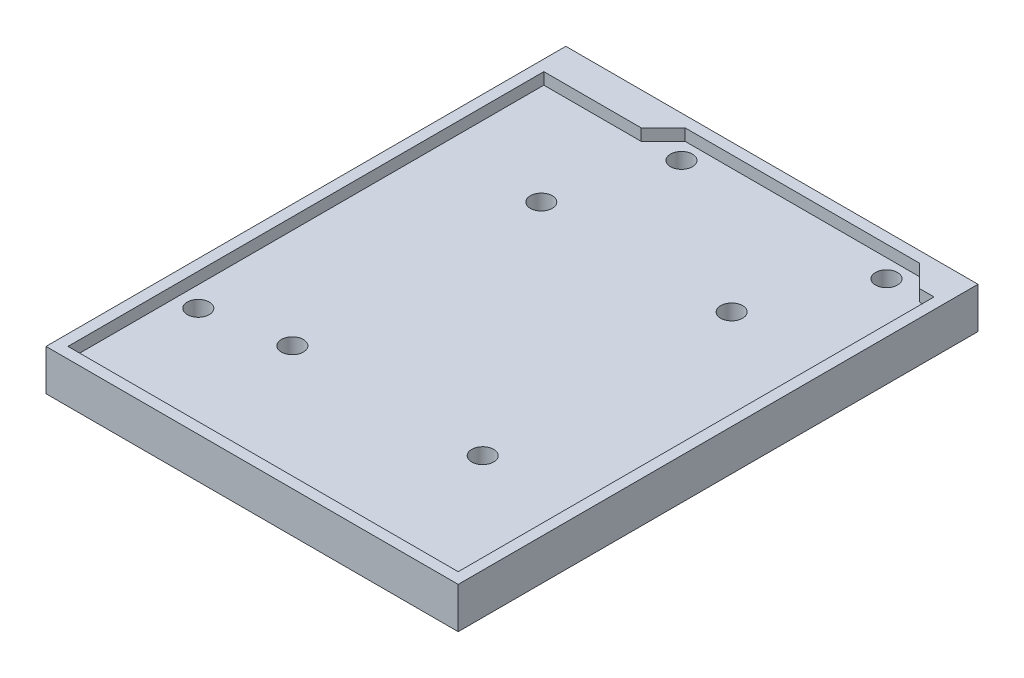
ISO-10303-21;
HEADER;
FILE_DESCRIPTION(('STEP AP214'),'2;1');
FILE_NAME('part.step','',(''),(''),'','','');
FILE_SCHEMA(('AUTOMOTIVE_DESIGN { 1 0 10303 214 1 1 1 1 }'));
ENDSEC;
DATA;
#1=APPLICATION_CONTEXT('core data for automotive mechanical design processes');
#2=APPLICATION_PROTOCOL_DEFINITION('international standard','automotive_design',2000,#1);
#3=PRODUCT_CONTEXT('',#1,'mechanical');
#4=PRODUCT('Part','Part','',(#3));
#5=PRODUCT_RELATED_PRODUCT_CATEGORY('part','',(#4));
#6=PRODUCT_DEFINITION_FORMATION('','',#4);
#7=PRODUCT_DEFINITION_CONTEXT('part definition',#1,'design');
#8=PRODUCT_DEFINITION('design','',#6,#7);
#9=PRODUCT_DEFINITION_SHAPE('','',#8);
#10=(LENGTH_UNIT() NAMED_UNIT(*) SI_UNIT(.MILLI.,.METRE.));
#11=(NAMED_UNIT(*) PLANE_ANGLE_UNIT() SI_UNIT($,.RADIAN.));
#12=(NAMED_UNIT(*) SI_UNIT($,.STERADIAN.) SOLID_ANGLE_UNIT());
#13=UNCERTAINTY_MEASURE_WITH_UNIT(LENGTH_MEASURE(1.E-05),#10,'distance_accuracy_value','');
#14=(GEOMETRIC_REPRESENTATION_CONTEXT(3) GLOBAL_UNCERTAINTY_ASSIGNED_CONTEXT((#13)) GLOBAL_UNIT_ASSIGNED_CONTEXT((#10,
#11,#12)) REPRESENTATION_CONTEXT('',''));
#15=CARTESIAN_POINT('',(0.,0.,0.));
#16=DIRECTION('',(0.,0.,1.));
#17=DIRECTION('',(1.,0.,0.));
#18=AXIS2_PLACEMENT_3D('',#15,#16,#17);
#19=CARTESIAN_POINT('',(28.15,5.6,-35.5));
#20=DIRECTION('',(-1.,0.,0.));
#21=DIRECTION('',(0.,0.,1.));
#22=AXIS2_PLACEMENT_3D('',#19,#20,#21);
#23=PLANE('',#22);
#24=DIRECTION('',(0.,0.,-1.));
#25=VECTOR('',#24,1.);
#26=CARTESIAN_POINT('',(28.15,0.,-35.5));
#27=LINE('',#26,#25);
#28=CARTESIAN_POINT('',(28.15,0.,35.5));
#29=VERTEX_POINT('',#28);
#30=CARTESIAN_POINT('',(28.15,0.,-35.5));
#31=VERTEX_POINT('',#30);
#32=EDGE_CURVE('E193',#29,#31,#27,.T.);
#33=ORIENTED_EDGE('',*,*,#32,.T.);
#34=DIRECTION('',(0.,-1.,0.));
#35=VECTOR('',#34,1.);
#36=CARTESIAN_POINT('',(28.15,5.6,-35.5));
#37=LINE('',#36,#35);
#38=CARTESIAN_POINT('',(28.15,5.6,-35.5));
#39=VERTEX_POINT('',#38);
#40=EDGE_CURVE('E11',#39,#31,#37,.T.);
#41=ORIENTED_EDGE('',*,*,#40,.F.);
#42=DIRECTION('',(0.,0.,-1.));
#43=VECTOR('',#42,1.);
#44=CARTESIAN_POINT('',(28.15,5.6,-35.5));
#45=LINE('',#44,#43);
#46=CARTESIAN_POINT('',(28.15,5.6,35.5));
#47=VERTEX_POINT('',#46);
#48=EDGE_CURVE('E205',#47,#39,#45,.T.);
#49=ORIENTED_EDGE('',*,*,#48,.F.);
#50=DIRECTION('',(0.,-1.,0.));
#51=VECTOR('',#50,1.);
#52=CARTESIAN_POINT('',(28.15,5.6,35.5));
#53=LINE('',#52,#51);
#54=EDGE_CURVE('E211',#47,#29,#53,.T.);
#55=ORIENTED_EDGE('',*,*,#54,.T.);
#56=EDGE_LOOP('',(#33,#41,#49,#55));
#57=FACE_BOUND('',#56,.T.);
#58=ADVANCED_FACE('F33',(#57),#23,.F.);
#59=CARTESIAN_POINT('',(-28.15,5.6,-35.5));
#60=DIRECTION('',(0.,0.,1.));
#61=DIRECTION('',(1.,0.,0.));
#62=AXIS2_PLACEMENT_3D('',#59,#60,#61);
#63=PLANE('',#62);
#64=DIRECTION('',(-1.,0.,0.));
#65=VECTOR('',#64,1.);
#66=CARTESIAN_POINT('',(-28.15,0.,-35.5));
#67=LINE('',#66,#65);
#68=CARTESIAN_POINT('',(-28.15,0.,-35.5));
#69=VERTEX_POINT('',#68);
#70=EDGE_CURVE('E214',#31,#69,#67,.T.);
#71=ORIENTED_EDGE('',*,*,#70,.T.);
#72=DIRECTION('',(0.,-1.,0.));
#73=VECTOR('',#72,1.);
#74=CARTESIAN_POINT('',(-28.15,5.6,-35.5));
#75=LINE('',#74,#73);
#76=CARTESIAN_POINT('',(-28.15,5.6,-35.5));
#77=VERTEX_POINT('',#76);
#78=EDGE_CURVE('E40',#77,#69,#75,.T.);
#79=ORIENTED_EDGE('',*,*,#78,.F.);
#80=DIRECTION('',(-1.,0.,0.));
#81=VECTOR('',#80,1.);
#82=CARTESIAN_POINT('',(-28.15,5.6,-35.5));
#83=LINE('',#82,#81);
#84=EDGE_CURVE('E84',#39,#77,#83,.T.);
#85=ORIENTED_EDGE('',*,*,#84,.F.);
#86=ORIENTED_EDGE('',*,*,#40,.T.);
#87=EDGE_LOOP('',(#71,#79,#85,#86));
#88=FACE_BOUND('',#87,.T.);
#89=ADVANCED_FACE('F243',(#88),#63,.F.);
#90=CARTESIAN_POINT('',(-28.15,5.6,-35.5));
#91=DIRECTION('',(1.,0.,0.));
#92=DIRECTION('',(0.,0.,-1.));
#93=AXIS2_PLACEMENT_3D('',#90,#91,#92);
#94=PLANE('',#93);
#95=DIRECTION('',(0.,0.,1.));
#96=VECTOR('',#95,1.);
#97=CARTESIAN_POINT('',(-28.15,0.,-35.5));
#98=LINE('',#97,#96);
#99=CARTESIAN_POINT('',(-28.15,0.,35.5));
#100=VERTEX_POINT('',#99);
#101=EDGE_CURVE('E216',#69,#100,#98,.T.);
#102=ORIENTED_EDGE('',*,*,#101,.T.);
#103=DIRECTION('',(0.,-1.,0.));
#104=VECTOR('',#103,1.);
#105=CARTESIAN_POINT('',(-28.15,5.6,35.5));
#106=LINE('',#105,#104);
#107=CARTESIAN_POINT('',(-28.15,5.6,35.5));
#108=VERTEX_POINT('',#107);
#109=EDGE_CURVE('E220',#108,#100,#106,.T.);
#110=ORIENTED_EDGE('',*,*,#109,.F.);
#111=DIRECTION('',(0.,0.,1.));
#112=VECTOR('',#111,1.);
#113=CARTESIAN_POINT('',(-28.15,5.6,-35.5));
#114=LINE('',#113,#112);
#115=EDGE_CURVE('E208',#77,#108,#114,.T.);
#116=ORIENTED_EDGE('',*,*,#115,.F.);
#117=ORIENTED_EDGE('',*,*,#78,.T.);
#118=EDGE_LOOP('',(#102,#110,#116,#117));
#119=FACE_BOUND('',#118,.T.);
#120=ADVANCED_FACE('F225',(#119),#94,.F.);
#121=CARTESIAN_POINT('',(-28.15,5.6,35.5));
#122=DIRECTION('',(0.,0.,-1.));
#123=DIRECTION('',(-1.,0.,0.));
#124=AXIS2_PLACEMENT_3D('',#121,#122,#123);
#125=PLANE('',#124);
#126=DIRECTION('',(1.,0.,0.));
#127=VECTOR('',#126,1.);
#128=CARTESIAN_POINT('',(-28.15,0.,35.5));
#129=LINE('',#128,#127);
#130=EDGE_CURVE('E77',#100,#29,#129,.T.);
#131=ORIENTED_EDGE('',*,*,#130,.T.);
#132=ORIENTED_EDGE('',*,*,#54,.F.);
#133=DIRECTION('',(1.,0.,0.));
#134=VECTOR('',#133,1.);
#135=CARTESIAN_POINT('',(-28.15,5.6,35.5));
#136=LINE('',#135,#134);
#137=EDGE_CURVE('E56',#108,#47,#136,.T.);
#138=ORIENTED_EDGE('',*,*,#137,.F.);
#139=ORIENTED_EDGE('',*,*,#109,.T.);
#140=EDGE_LOOP('',(#131,#132,#138,#139));
#141=FACE_BOUND('',#140,.T.);
#142=ADVANCED_FACE('F233',(#141),#125,.F.);
#143=CARTESIAN_POINT('',(0.,5.6,0.));
#144=DIRECTION('',(0.,1.,0.));
#145=DIRECTION('',(0.,0.,1.));
#146=AXIS2_PLACEMENT_3D('',#143,#144,#145);
#147=PLANE('',#146);
#148=DIRECTION('',(0.,0.,-1.));
#149=VECTOR('',#148,1.);
#150=CARTESIAN_POINT('',(26.65,5.6,-31.));
#151=LINE('',#150,#149);
#152=CARTESIAN_POINT('',(26.65,5.6,34.));
#153=VERTEX_POINT('',#152);
#154=CARTESIAN_POINT('',(26.65,5.6,-31.));
#155=VERTEX_POINT('',#154);
#156=EDGE_CURVE('E47',#153,#155,#151,.T.);
#157=ORIENTED_EDGE('',*,*,#156,.F.);
#158=DIRECTION('',(1.,0.,0.));
#159=VECTOR('',#158,1.);
#160=CARTESIAN_POINT('',(26.65,5.6,34.));
#161=LINE('',#160,#159);
#162=CARTESIAN_POINT('',(-26.65,5.6,34.));
#163=VERTEX_POINT('',#162);
#164=EDGE_CURVE('E151',#163,#153,#161,.T.);
#165=ORIENTED_EDGE('',*,*,#164,.F.);
#166=DIRECTION('',(0.,0.,1.));
#167=VECTOR('',#166,1.);
#168=CARTESIAN_POINT('',(-26.65,5.6,34.));
#169=LINE('',#168,#167);
#170=CARTESIAN_POINT('',(-26.65,5.6,-31.));
#171=VERTEX_POINT('',#170);
#172=EDGE_CURVE('E154',#171,#163,#169,.T.);
#173=ORIENTED_EDGE('',*,*,#172,.F.);
#174=DIRECTION('',(-1.,0.,0.));
#175=VECTOR('',#174,1.);
#176=CARTESIAN_POINT('',(-26.65,5.6,-31.));
#177=LINE('',#176,#175);
#178=CARTESIAN_POINT('',(-13.35,5.6,-31.));
#179=VERTEX_POINT('',#178);
#180=EDGE_CURVE('E186',#179,#171,#177,.T.);
#181=ORIENTED_EDGE('',*,*,#180,.F.);
#182=DIRECTION('',(-0.707106781186548,0.,0.707106781186547));
#183=VECTOR('',#182,1.);
#184=CARTESIAN_POINT('',(-13.35,5.6,-31.));
#185=LINE('',#184,#183);
#186=CARTESIAN_POINT('',(-10.35,5.6,-34.));
#187=VERTEX_POINT('',#186);
#188=EDGE_CURVE('E183',#187,#179,#185,.T.);
#189=ORIENTED_EDGE('',*,*,#188,.F.);
#190=DIRECTION('',(-1.,0.,0.));
#191=VECTOR('',#190,1.);
#192=CARTESIAN_POINT('',(-10.35,5.6,-34.));
#193=LINE('',#192,#191);
#194=CARTESIAN_POINT('',(21.65,5.6,-34.));
#195=VERTEX_POINT('',#194);
#196=EDGE_CURVE('E180',#195,#187,#193,.T.);
#197=ORIENTED_EDGE('',*,*,#196,.F.);
#198=DIRECTION('',(-0.707106781186547,0.,-0.707106781186547));
#199=VECTOR('',#198,1.);
#200=CARTESIAN_POINT('',(21.65,5.6,-34.));
#201=LINE('',#200,#199);
#202=CARTESIAN_POINT('',(24.65,5.6,-31.));
#203=VERTEX_POINT('',#202);
#204=EDGE_CURVE('E177',#203,#195,#201,.T.);
#205=ORIENTED_EDGE('',*,*,#204,.F.);
#206=DIRECTION('',(-1.,0.,0.));
#207=VECTOR('',#206,1.);
#208=CARTESIAN_POINT('',(26.65,5.6,-31.));
#209=LINE('',#208,#207);
#210=EDGE_CURVE('E174',#155,#203,#209,.T.);
#211=ORIENTED_EDGE('',*,*,#210,.F.);
#212=EDGE_LOOP('',(#157,#165,#173,#181,#189,#197,#205,#211));
#213=FACE_BOUND('',#212,.T.);
#214=ORIENTED_EDGE('',*,*,#48,.T.);
#215=ORIENTED_EDGE('',*,*,#84,.T.);
#216=ORIENTED_EDGE('',*,*,#115,.T.);
#217=ORIENTED_EDGE('',*,*,#137,.T.);
#218=EDGE_LOOP('',(#214,#215,#216,#217));
#219=FACE_BOUND('',#218,.T.);
#220=ADVANCED_FACE('F235',(#213,#219),#147,.T.);
#221=CARTESIAN_POINT('',(0.,0.,0.));
#222=DIRECTION('',(0.,1.,0.));
#223=DIRECTION('',(0.,0.,1.));
#224=AXIS2_PLACEMENT_3D('',#221,#222,#223);
#225=PLANE('',#224);
#226=CARTESIAN_POINT('',(-13.,0.,17.));
#227=DIRECTION('',(0.,1.,0.));
#228=DIRECTION('',(0.,0.,1.));
#229=AXIS2_PLACEMENT_3D('',#226,#227,#228);
#230=CIRCLE('',#229,1.5);
#231=CARTESIAN_POINT('',(-13.,0.,18.5));
#232=VERTEX_POINT('',#231);
#233=EDGE_CURVE('E436',#232,#232,#230,.T.);
#234=ORIENTED_EDGE('',*,*,#233,.T.);
#235=EDGE_LOOP('',(#234));
#236=FACE_BOUND('',#235,.T.);
#237=CARTESIAN_POINT('',(13.,0.,-17.));
#238=DIRECTION('',(0.,1.,0.));
#239=DIRECTION('',(0.,0.,1.));
#240=AXIS2_PLACEMENT_3D('',#237,#238,#239);
#241=CIRCLE('',#240,1.5);
#242=CARTESIAN_POINT('',(13.,0.,-15.5));
#243=VERTEX_POINT('',#242);
#244=EDGE_CURVE('E488',#243,#243,#241,.T.);
#245=ORIENTED_EDGE('',*,*,#244,.T.);
#246=EDGE_LOOP('',(#245));
#247=FACE_BOUND('',#246,.T.);
#248=CARTESIAN_POINT('',(13.,0.,17.));
#249=DIRECTION('',(0.,1.,0.));
#250=DIRECTION('',(0.,0.,1.));
#251=AXIS2_PLACEMENT_3D('',#248,#249,#250);
#252=CIRCLE('',#251,1.5);
#253=CARTESIAN_POINT('',(13.,0.,18.5));
#254=VERTEX_POINT('',#253);
#255=EDGE_CURVE('E452',#254,#254,#252,.T.);
#256=ORIENTED_EDGE('',*,*,#255,.T.);
#257=EDGE_LOOP('',(#256));
#258=FACE_BOUND('',#257,.T.);
#259=CARTESIAN_POINT('',(-13.,0.,-17.));
#260=DIRECTION('',(0.,1.,0.));
#261=DIRECTION('',(0.,0.,1.));
#262=AXIS2_PLACEMENT_3D('',#259,#260,#261);
#263=CIRCLE('',#262,1.5);
#264=CARTESIAN_POINT('',(-13.,0.,-15.5));
#265=VERTEX_POINT('',#264);
#266=EDGE_CURVE('E445',#265,#265,#263,.T.);
#267=ORIENTED_EDGE('',*,*,#266,.T.);
#268=EDGE_LOOP('',(#267));
#269=FACE_BOUND('',#268,.T.);
#270=CARTESIAN_POINT('',(-23.85,0.,19.));
#271=DIRECTION('',(0.,1.,0.));
#272=DIRECTION('',(0.,0.,1.));
#273=AXIS2_PLACEMENT_3D('',#270,#271,#272);
#274=CIRCLE('',#273,1.5);
#275=CARTESIAN_POINT('',(-23.85,0.,20.5));
#276=VERTEX_POINT('',#275);
#277=EDGE_CURVE('E459',#276,#276,#274,.T.);
#278=ORIENTED_EDGE('',*,*,#277,.T.);
#279=EDGE_LOOP('',(#278));
#280=FACE_BOUND('',#279,.T.);
#281=CARTESIAN_POINT('',(19.65,0.,-31.5));
#282=DIRECTION('',(0.,1.,0.));
#283=DIRECTION('',(0.,0.,1.));
#284=AXIS2_PLACEMENT_3D('',#281,#282,#283);
#285=CIRCLE('',#284,1.5);
#286=CARTESIAN_POINT('',(19.65,0.,-30.));
#287=VERTEX_POINT('',#286);
#288=EDGE_CURVE('E453',#287,#287,#285,.T.);
#289=ORIENTED_EDGE('',*,*,#288,.T.);
#290=EDGE_LOOP('',(#289));
#291=FACE_BOUND('',#290,.T.);
#292=CARTESIAN_POINT('',(-8.34999999999999,0.,-31.5));
#293=DIRECTION('',(0.,1.,0.));
#294=DIRECTION('',(0.,0.,1.));
#295=AXIS2_PLACEMENT_3D('',#292,#293,#294);
#296=CIRCLE('',#295,1.5);
#297=CARTESIAN_POINT('',(-8.34999999999999,0.,-30.));
#298=VERTEX_POINT('',#297);
#299=EDGE_CURVE('E175',#298,#298,#296,.T.);
#300=ORIENTED_EDGE('',*,*,#299,.T.);
#301=EDGE_LOOP('',(#300));
#302=FACE_BOUND('',#301,.T.);
#303=ORIENTED_EDGE('',*,*,#32,.F.);
#304=ORIENTED_EDGE('',*,*,#130,.F.);
#305=ORIENTED_EDGE('',*,*,#101,.F.);
#306=ORIENTED_EDGE('',*,*,#70,.F.);
#307=EDGE_LOOP('',(#303,#304,#305,#306));
#308=FACE_BOUND('',#307,.T.);
#309=ADVANCED_FACE('F229',(#236,#247,#258,#269,#280,#291,#302,#308),#225,.F.);
#310=CARTESIAN_POINT('',(26.65,4.,-31.));
#311=DIRECTION('',(1.,0.,0.));
#312=DIRECTION('',(0.,0.,-1.));
#313=AXIS2_PLACEMENT_3D('',#310,#311,#312);
#314=PLANE('',#313);
#315=ORIENTED_EDGE('',*,*,#156,.T.);
#316=DIRECTION('',(0.,1.,0.));
#317=VECTOR('',#316,1.);
#318=CARTESIAN_POINT('',(26.65,4.,-31.));
#319=LINE('',#318,#317);
#320=CARTESIAN_POINT('',(26.65,4.,-31.));
#321=VERTEX_POINT('',#320);
#322=EDGE_CURVE('E128',#321,#155,#319,.T.);
#323=ORIENTED_EDGE('',*,*,#322,.F.);
#324=DIRECTION('',(0.,0.,-1.));
#325=VECTOR('',#324,1.);
#326=CARTESIAN_POINT('',(26.65,4.,-31.));
#327=LINE('',#326,#325);
#328=CARTESIAN_POINT('',(26.65,4.,34.));
#329=VERTEX_POINT('',#328);
#330=EDGE_CURVE('E132',#329,#321,#327,.T.);
#331=ORIENTED_EDGE('',*,*,#330,.F.);
#332=DIRECTION('',(0.,1.,0.));
#333=VECTOR('',#332,1.);
#334=CARTESIAN_POINT('',(26.65,4.,34.));
#335=LINE('',#334,#333);
#336=EDGE_CURVE('E191',#329,#153,#335,.T.);
#337=ORIENTED_EDGE('',*,*,#336,.T.);
#338=EDGE_LOOP('',(#315,#323,#331,#337));
#339=FACE_BOUND('',#338,.T.);
#340=ADVANCED_FACE('F130',(#339),#314,.F.);
#341=CARTESIAN_POINT('',(26.65,4.,34.));
#342=DIRECTION('',(0.,0.,1.));
#343=DIRECTION('',(1.,0.,0.));
#344=AXIS2_PLACEMENT_3D('',#341,#342,#343);
#345=PLANE('',#344);
#346=ORIENTED_EDGE('',*,*,#164,.T.);
#347=ORIENTED_EDGE('',*,*,#336,.F.);
#348=DIRECTION('',(1.,0.,0.));
#349=VECTOR('',#348,1.);
#350=CARTESIAN_POINT('',(26.65,4.,34.));
#351=LINE('',#350,#349);
#352=CARTESIAN_POINT('',(-26.65,4.,34.));
#353=VERTEX_POINT('',#352);
#354=EDGE_CURVE('E138',#353,#329,#351,.T.);
#355=ORIENTED_EDGE('',*,*,#354,.F.);
#356=DIRECTION('',(0.,1.,0.));
#357=VECTOR('',#356,1.);
#358=CARTESIAN_POINT('',(-26.65,4.,34.));
#359=LINE('',#358,#357);
#360=EDGE_CURVE('E194',#353,#163,#359,.T.);
#361=ORIENTED_EDGE('',*,*,#360,.T.);
#362=EDGE_LOOP('',(#346,#347,#355,#361));
#363=FACE_BOUND('',#362,.T.);
#364=ADVANCED_FACE('F277',(#363),#345,.F.);
#365=CARTESIAN_POINT('',(-26.65,4.,34.));
#366=DIRECTION('',(-1.,0.,0.));
#367=DIRECTION('',(0.,0.,1.));
#368=AXIS2_PLACEMENT_3D('',#365,#366,#367);
#369=PLANE('',#368);
#370=ORIENTED_EDGE('',*,*,#172,.T.);
#371=ORIENTED_EDGE('',*,*,#360,.F.);
#372=DIRECTION('',(0.,0.,1.));
#373=VECTOR('',#372,1.);
#374=CARTESIAN_POINT('',(-26.65,4.,34.));
#375=LINE('',#374,#373);
#376=CARTESIAN_POINT('',(-26.65,4.,-31.));
#377=VERTEX_POINT('',#376);
#378=EDGE_CURVE('E170',#377,#353,#375,.T.);
#379=ORIENTED_EDGE('',*,*,#378,.F.);
#380=DIRECTION('',(0.,1.,0.));
#381=VECTOR('',#380,1.);
#382=CARTESIAN_POINT('',(-26.65,4.,-31.));
#383=LINE('',#382,#381);
#384=EDGE_CURVE('E196',#377,#171,#383,.T.);
#385=ORIENTED_EDGE('',*,*,#384,.T.);
#386=EDGE_LOOP('',(#370,#371,#379,#385));
#387=FACE_BOUND('',#386,.T.);
#388=ADVANCED_FACE('F286',(#387),#369,.F.);
#389=CARTESIAN_POINT('',(-26.65,4.,-31.));
#390=DIRECTION('',(0.,0.,-1.));
#391=DIRECTION('',(-1.,0.,0.));
#392=AXIS2_PLACEMENT_3D('',#389,#390,#391);
#393=PLANE('',#392);
#394=ORIENTED_EDGE('',*,*,#180,.T.);
#395=ORIENTED_EDGE('',*,*,#384,.F.);
#396=DIRECTION('',(-1.,0.,0.));
#397=VECTOR('',#396,1.);
#398=CARTESIAN_POINT('',(-26.65,4.,-31.));
#399=LINE('',#398,#397);
#400=CARTESIAN_POINT('',(-13.35,4.,-31.));
#401=VERTEX_POINT('',#400);
#402=EDGE_CURVE('E167',#401,#377,#399,.T.);
#403=ORIENTED_EDGE('',*,*,#402,.F.);
#404=DIRECTION('',(0.,1.,0.));
#405=VECTOR('',#404,1.);
#406=CARTESIAN_POINT('',(-13.35,4.,-31.));
#407=LINE('',#406,#405);
#408=EDGE_CURVE('E198',#401,#179,#407,.T.);
#409=ORIENTED_EDGE('',*,*,#408,.T.);
#410=EDGE_LOOP('',(#394,#395,#403,#409));
#411=FACE_BOUND('',#410,.T.);
#412=ADVANCED_FACE('F296',(#411),#393,.F.);
#413=CARTESIAN_POINT('',(-13.35,4.,-31.));
#414=DIRECTION('',(-0.707106781186547,0.,-0.707106781186548));
#415=DIRECTION('',(-0.707106781186548,0.,0.707106781186547));
#416=AXIS2_PLACEMENT_3D('',#413,#414,#415);
#417=PLANE('',#416);
#418=ORIENTED_EDGE('',*,*,#188,.T.);
#419=ORIENTED_EDGE('',*,*,#408,.F.);
#420=DIRECTION('',(-0.707106781186548,0.,0.707106781186547));
#421=VECTOR('',#420,1.);
#422=CARTESIAN_POINT('',(-13.35,4.,-31.));
#423=LINE('',#422,#421);
#424=CARTESIAN_POINT('',(-10.35,4.,-34.));
#425=VERTEX_POINT('',#424);
#426=EDGE_CURVE('E164',#425,#401,#423,.T.);
#427=ORIENTED_EDGE('',*,*,#426,.F.);
#428=DIRECTION('',(0.,1.,0.));
#429=VECTOR('',#428,1.);
#430=CARTESIAN_POINT('',(-10.35,4.,-34.));
#431=LINE('',#430,#429);
#432=EDGE_CURVE('E200',#425,#187,#431,.T.);
#433=ORIENTED_EDGE('',*,*,#432,.T.);
#434=EDGE_LOOP('',(#418,#419,#427,#433));
#435=FACE_BOUND('',#434,.T.);
#436=ADVANCED_FACE('F306',(#435),#417,.F.);
#437=CARTESIAN_POINT('',(-10.35,4.,-34.));
#438=DIRECTION('',(0.,0.,-1.));
#439=DIRECTION('',(-1.,0.,0.));
#440=AXIS2_PLACEMENT_3D('',#437,#438,#439);
#441=PLANE('',#440);
#442=ORIENTED_EDGE('',*,*,#196,.T.);
#443=ORIENTED_EDGE('',*,*,#432,.F.);
#444=DIRECTION('',(-1.,0.,0.));
#445=VECTOR('',#444,1.);
#446=CARTESIAN_POINT('',(-10.35,4.,-34.));
#447=LINE('',#446,#445);
#448=CARTESIAN_POINT('',(21.65,4.,-34.));
#449=VERTEX_POINT('',#448);
#450=EDGE_CURVE('E161',#449,#425,#447,.T.);
#451=ORIENTED_EDGE('',*,*,#450,.F.);
#452=DIRECTION('',(0.,1.,0.));
#453=VECTOR('',#452,1.);
#454=CARTESIAN_POINT('',(21.65,4.,-34.));
#455=LINE('',#454,#453);
#456=EDGE_CURVE('E202',#449,#195,#455,.T.);
#457=ORIENTED_EDGE('',*,*,#456,.T.);
#458=EDGE_LOOP('',(#442,#443,#451,#457));
#459=FACE_BOUND('',#458,.T.);
#460=ADVANCED_FACE('F316',(#459),#441,.F.);
#461=CARTESIAN_POINT('',(21.65,4.,-34.));
#462=DIRECTION('',(0.707106781186548,0.,-0.707106781186548));
#463=DIRECTION('',(-0.707106781186548,0.,-0.707106781186548));
#464=AXIS2_PLACEMENT_3D('',#461,#462,#463);
#465=PLANE('',#464);
#466=ORIENTED_EDGE('',*,*,#204,.T.);
#467=ORIENTED_EDGE('',*,*,#456,.F.);
#468=DIRECTION('',(-0.707106781186547,0.,-0.707106781186547));
#469=VECTOR('',#468,1.);
#470=CARTESIAN_POINT('',(21.65,4.,-34.));
#471=LINE('',#470,#469);
#472=CARTESIAN_POINT('',(24.65,4.,-31.));
#473=VERTEX_POINT('',#472);
#474=EDGE_CURVE('E146',#473,#449,#471,.T.);
#475=ORIENTED_EDGE('',*,*,#474,.F.);
#476=DIRECTION('',(0.,1.,0.));
#477=VECTOR('',#476,1.);
#478=CARTESIAN_POINT('',(24.65,4.,-31.));
#479=LINE('',#478,#477);
#480=EDGE_CURVE('E137',#473,#203,#479,.T.);
#481=ORIENTED_EDGE('',*,*,#480,.T.);
#482=EDGE_LOOP('',(#466,#467,#475,#481));
#483=FACE_BOUND('',#482,.T.);
#484=ADVANCED_FACE('F326',(#483),#465,.F.);
#485=CARTESIAN_POINT('',(26.65,4.,-31.));
#486=DIRECTION('',(0.,0.,-1.));
#487=DIRECTION('',(-1.,0.,0.));
#488=AXIS2_PLACEMENT_3D('',#485,#486,#487);
#489=PLANE('',#488);
#490=ORIENTED_EDGE('',*,*,#210,.T.);
#491=ORIENTED_EDGE('',*,*,#480,.F.);
#492=DIRECTION('',(-1.,0.,0.));
#493=VECTOR('',#492,1.);
#494=CARTESIAN_POINT('',(26.65,4.,-31.));
#495=LINE('',#494,#493);
#496=EDGE_CURVE('E141',#321,#473,#495,.T.);
#497=ORIENTED_EDGE('',*,*,#496,.F.);
#498=ORIENTED_EDGE('',*,*,#322,.T.);
#499=EDGE_LOOP('',(#490,#491,#497,#498));
#500=FACE_BOUND('',#499,.T.);
#501=ADVANCED_FACE('F142',(#500),#489,.F.);
#502=CARTESIAN_POINT('',(0.,4.,0.));
#503=DIRECTION('',(0.,-1.,0.));
#504=DIRECTION('',(0.,0.,-1.));
#505=AXIS2_PLACEMENT_3D('',#502,#503,#504);
#506=PLANE('',#505);
#507=CARTESIAN_POINT('',(-13.,4.,17.));
#508=DIRECTION('',(0.,1.,0.));
#509=DIRECTION('',(0.,0.,1.));
#510=AXIS2_PLACEMENT_3D('',#507,#508,#509);
#511=CIRCLE('',#510,1.5);
#512=CARTESIAN_POINT('',(-13.,4.,18.5));
#513=VERTEX_POINT('',#512);
#514=EDGE_CURVE('E439',#513,#513,#511,.T.);
#515=ORIENTED_EDGE('',*,*,#514,.F.);
#516=EDGE_LOOP('',(#515));
#517=FACE_BOUND('',#516,.T.);
#518=CARTESIAN_POINT('',(13.,4.,-17.));
#519=DIRECTION('',(0.,1.,0.));
#520=DIRECTION('',(0.,0.,1.));
#521=AXIS2_PLACEMENT_3D('',#518,#519,#520);
#522=CIRCLE('',#521,1.5);
#523=CARTESIAN_POINT('',(13.,4.,-15.5));
#524=VERTEX_POINT('',#523);
#525=EDGE_CURVE('E441',#524,#524,#522,.T.);
#526=ORIENTED_EDGE('',*,*,#525,.F.);
#527=EDGE_LOOP('',(#526));
#528=FACE_BOUND('',#527,.T.);
#529=CARTESIAN_POINT('',(13.,4.,17.));
#530=DIRECTION('',(0.,1.,0.));
#531=DIRECTION('',(0.,0.,1.));
#532=AXIS2_PLACEMENT_3D('',#529,#530,#531);
#533=CIRCLE('',#532,1.5);
#534=CARTESIAN_POINT('',(13.,4.,18.5));
#535=VERTEX_POINT('',#534);
#536=EDGE_CURVE('E483',#535,#535,#533,.T.);
#537=ORIENTED_EDGE('',*,*,#536,.F.);
#538=EDGE_LOOP('',(#537));
#539=FACE_BOUND('',#538,.T.);
#540=CARTESIAN_POINT('',(-13.,4.,-17.));
#541=DIRECTION('',(0.,1.,0.));
#542=DIRECTION('',(0.,0.,1.));
#543=AXIS2_PLACEMENT_3D('',#540,#541,#542);
#544=CIRCLE('',#543,1.5);
#545=CARTESIAN_POINT('',(-13.,4.,-15.5));
#546=VERTEX_POINT('',#545);
#547=EDGE_CURVE('E449',#546,#546,#544,.T.);
#548=ORIENTED_EDGE('',*,*,#547,.F.);
#549=EDGE_LOOP('',(#548));
#550=FACE_BOUND('',#549,.T.);
#551=CARTESIAN_POINT('',(-23.85,4.,19.));
#552=DIRECTION('',(0.,1.,0.));
#553=DIRECTION('',(0.,0.,1.));
#554=AXIS2_PLACEMENT_3D('',#551,#552,#553);
#555=CIRCLE('',#554,1.5);
#556=CARTESIAN_POINT('',(-23.85,4.,20.5));
#557=VERTEX_POINT('',#556);
#558=EDGE_CURVE('E448',#557,#557,#555,.T.);
#559=ORIENTED_EDGE('',*,*,#558,.F.);
#560=EDGE_LOOP('',(#559));
#561=FACE_BOUND('',#560,.T.);
#562=CARTESIAN_POINT('',(19.65,4.,-31.5));
#563=DIRECTION('',(0.,1.,0.));
#564=DIRECTION('',(0.,0.,1.));
#565=AXIS2_PLACEMENT_3D('',#562,#563,#564);
#566=CIRCLE('',#565,1.5);
#567=CARTESIAN_POINT('',(19.65,4.,-30.));
#568=VERTEX_POINT('',#567);
#569=EDGE_CURVE('E456',#568,#568,#566,.T.);
#570=ORIENTED_EDGE('',*,*,#569,.F.);
#571=EDGE_LOOP('',(#570));
#572=FACE_BOUND('',#571,.T.);
#573=CARTESIAN_POINT('',(-8.34999999999999,4.,-31.5));
#574=DIRECTION('',(0.,1.,0.));
#575=DIRECTION('',(0.,0.,1.));
#576=AXIS2_PLACEMENT_3D('',#573,#574,#575);
#577=CIRCLE('',#576,1.5);
#578=CARTESIAN_POINT('',(-8.34999999999999,4.,-30.));
#579=VERTEX_POINT('',#578);
#580=EDGE_CURVE('E157',#579,#579,#577,.T.);
#581=ORIENTED_EDGE('',*,*,#580,.F.);
#582=EDGE_LOOP('',(#581));
#583=FACE_BOUND('',#582,.T.);
#584=ORIENTED_EDGE('',*,*,#330,.T.);
#585=ORIENTED_EDGE('',*,*,#496,.T.);
#586=ORIENTED_EDGE('',*,*,#474,.T.);
#587=ORIENTED_EDGE('',*,*,#450,.T.);
#588=ORIENTED_EDGE('',*,*,#426,.T.);
#589=ORIENTED_EDGE('',*,*,#402,.T.);
#590=ORIENTED_EDGE('',*,*,#378,.T.);
#591=ORIENTED_EDGE('',*,*,#354,.T.);
#592=EDGE_LOOP('',(#584,#585,#586,#587,#588,#589,#590,#591));
#593=FACE_BOUND('',#592,.T.);
#594=ADVANCED_FACE('F148',(#517,#528,#539,#550,#561,#572,#583,#593),#506,.F.);
#595=CARTESIAN_POINT('',(-8.34999999999999,0.,-31.5));
#596=DIRECTION('',(0.,1.,0.));
#597=DIRECTION('',(0.,0.,1.));
#598=AXIS2_PLACEMENT_3D('',#595,#596,#597);
#599=CYLINDRICAL_SURFACE('',#598,1.5);
#600=ORIENTED_EDGE('',*,*,#299,.F.);
#601=EDGE_LOOP('',(#600));
#602=FACE_BOUND('',#601,.T.);
#603=ORIENTED_EDGE('',*,*,#580,.T.);
#604=EDGE_LOOP('',(#603));
#605=FACE_BOUND('',#604,.T.);
#606=ADVANCED_FACE('F351',(#602,#605),#599,.F.);
#607=CARTESIAN_POINT('',(19.65,0.,-31.5));
#608=DIRECTION('',(0.,1.,0.));
#609=DIRECTION('',(0.,0.,1.));
#610=AXIS2_PLACEMENT_3D('',#607,#608,#609);
#611=CYLINDRICAL_SURFACE('',#610,1.5);
#612=ORIENTED_EDGE('',*,*,#288,.F.);
#613=EDGE_LOOP('',(#612));
#614=FACE_BOUND('',#613,.T.);
#615=ORIENTED_EDGE('',*,*,#569,.T.);
#616=EDGE_LOOP('',(#615));
#617=FACE_BOUND('',#616,.T.);
#618=ADVANCED_FACE('F356',(#614,#617),#611,.F.);
#619=CARTESIAN_POINT('',(-23.85,0.,19.));
#620=DIRECTION('',(0.,1.,0.));
#621=DIRECTION('',(0.,0.,1.));
#622=AXIS2_PLACEMENT_3D('',#619,#620,#621);
#623=CYLINDRICAL_SURFACE('',#622,1.5);
#624=ORIENTED_EDGE('',*,*,#277,.F.);
#625=EDGE_LOOP('',(#624));
#626=FACE_BOUND('',#625,.T.);
#627=ORIENTED_EDGE('',*,*,#558,.T.);
#628=EDGE_LOOP('',(#627));
#629=FACE_BOUND('',#628,.T.);
#630=ADVANCED_FACE('F366',(#626,#629),#623,.F.);
#631=CARTESIAN_POINT('',(-13.,0.,-17.));
#632=DIRECTION('',(0.,1.,0.));
#633=DIRECTION('',(0.,0.,1.));
#634=AXIS2_PLACEMENT_3D('',#631,#632,#633);
#635=CYLINDRICAL_SURFACE('',#634,1.5);
#636=ORIENTED_EDGE('',*,*,#266,.F.);
#637=EDGE_LOOP('',(#636));
#638=FACE_BOUND('',#637,.T.);
#639=ORIENTED_EDGE('',*,*,#547,.T.);
#640=EDGE_LOOP('',(#639));
#641=FACE_BOUND('',#640,.T.);
#642=ADVANCED_FACE('F376',(#638,#641),#635,.F.);
#643=CARTESIAN_POINT('',(13.,0.,17.));
#644=DIRECTION('',(0.,1.,0.));
#645=DIRECTION('',(0.,0.,1.));
#646=AXIS2_PLACEMENT_3D('',#643,#644,#645);
#647=CYLINDRICAL_SURFACE('',#646,1.5);
#648=ORIENTED_EDGE('',*,*,#255,.F.);
#649=EDGE_LOOP('',(#648));
#650=FACE_BOUND('',#649,.T.);
#651=ORIENTED_EDGE('',*,*,#536,.T.);
#652=EDGE_LOOP('',(#651));
#653=FACE_BOUND('',#652,.T.);
#654=ADVANCED_FACE('F399',(#650,#653),#647,.F.);
#655=CARTESIAN_POINT('',(13.,0.,-17.));
#656=DIRECTION('',(0.,1.,0.));
#657=DIRECTION('',(0.,0.,1.));
#658=AXIS2_PLACEMENT_3D('',#655,#656,#657);
#659=CYLINDRICAL_SURFACE('',#658,1.5);
#660=ORIENTED_EDGE('',*,*,#244,.F.);
#661=EDGE_LOOP('',(#660));
#662=FACE_BOUND('',#661,.T.);
#663=ORIENTED_EDGE('',*,*,#525,.T.);
#664=EDGE_LOOP('',(#663));
#665=FACE_BOUND('',#664,.T.);
#666=ADVANCED_FACE('F409',(#662,#665),#659,.F.);
#667=CARTESIAN_POINT('',(-13.,0.,17.));
#668=DIRECTION('',(0.,1.,0.));
#669=DIRECTION('',(0.,0.,1.));
#670=AXIS2_PLACEMENT_3D('',#667,#668,#669);
#671=CYLINDRICAL_SURFACE('',#670,1.5);
#672=ORIENTED_EDGE('',*,*,#233,.F.);
#673=EDGE_LOOP('',(#672));
#674=FACE_BOUND('',#673,.T.);
#675=ORIENTED_EDGE('',*,*,#514,.T.);
#676=EDGE_LOOP('',(#675));
#677=FACE_BOUND('',#676,.T.);
#678=ADVANCED_FACE('F419',(#674,#677),#671,.F.);
#679=CLOSED_SHELL('',(#58,#89,#120,#142,#220,#309,#340,#364,#388,#412,#436,#460,#484,#501,#594,
#606,#618,#630,#642,#654,#666,#678));
#680=MANIFOLD_SOLID_BREP('B2',#679);
#681=ADVANCED_BREP_SHAPE_REPRESENTATION('',(#18,#680),#14);
#682=SHAPE_DEFINITION_REPRESENTATION(#9,#681);
ENDSEC;
END-ISO-10303-21;
